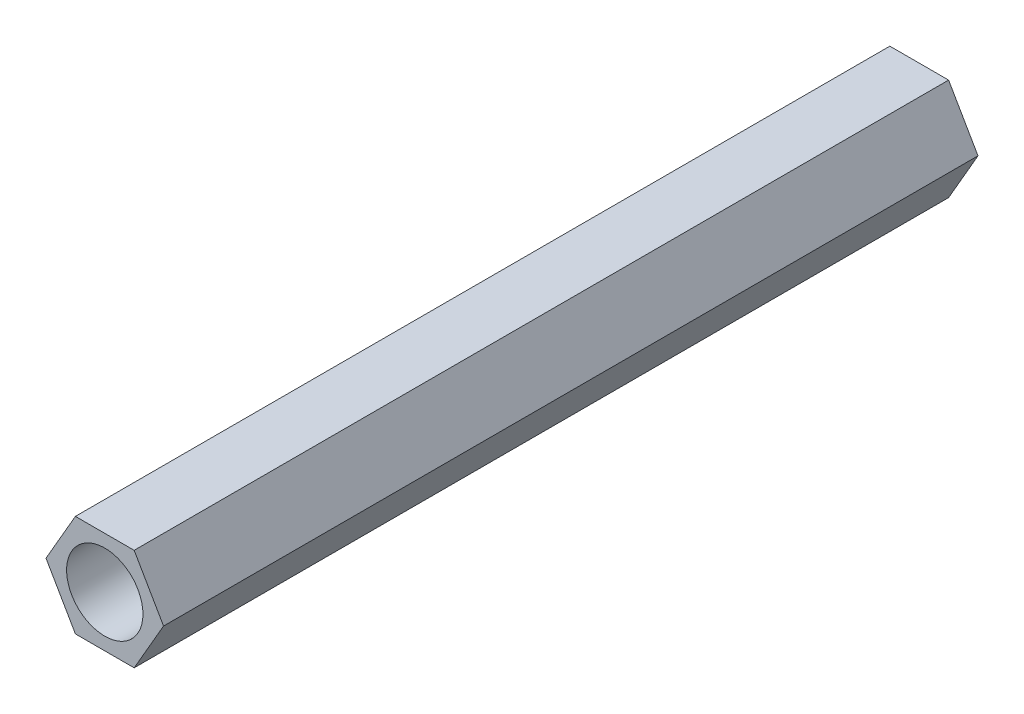
ISO-10303-21;
HEADER;
FILE_DESCRIPTION(('STEP AP214'),'2;1');
FILE_NAME('part.step','',(''),(''),'','','');
FILE_SCHEMA(('AUTOMOTIVE_DESIGN { 1 0 10303 214 1 1 1 1 }'));
ENDSEC;
DATA;
#1=APPLICATION_CONTEXT('core data for automotive mechanical design processes');
#2=APPLICATION_PROTOCOL_DEFINITION('international standard','automotive_design',2000,#1);
#3=PRODUCT_CONTEXT('',#1,'mechanical');
#4=PRODUCT('Part','Part','',(#3));
#5=PRODUCT_RELATED_PRODUCT_CATEGORY('part','',(#4));
#6=PRODUCT_DEFINITION_FORMATION('','',#4);
#7=PRODUCT_DEFINITION_CONTEXT('part definition',#1,'design');
#8=PRODUCT_DEFINITION('design','',#6,#7);
#9=PRODUCT_DEFINITION_SHAPE('','',#8);
#10=(LENGTH_UNIT() NAMED_UNIT(*) SI_UNIT(.MILLI.,.METRE.));
#11=(NAMED_UNIT(*) PLANE_ANGLE_UNIT() SI_UNIT($,.RADIAN.));
#12=(NAMED_UNIT(*) SI_UNIT($,.STERADIAN.) SOLID_ANGLE_UNIT());
#13=UNCERTAINTY_MEASURE_WITH_UNIT(LENGTH_MEASURE(1.E-05),#10,'distance_accuracy_value','');
#14=(GEOMETRIC_REPRESENTATION_CONTEXT(3) GLOBAL_UNCERTAINTY_ASSIGNED_CONTEXT((#13)) GLOBAL_UNIT_ASSIGNED_CONTEXT((#10,
#11,#12)) REPRESENTATION_CONTEXT('',''));
#15=CARTESIAN_POINT('',(0.,0.,0.));
#16=DIRECTION('',(0.,0.,1.));
#17=DIRECTION('',(1.,0.,0.));
#18=AXIS2_PLACEMENT_3D('',#15,#16,#17);
#19=CARTESIAN_POINT('',(0.,0.,32.));
#20=DIRECTION('',(0.,0.,1.));
#21=DIRECTION('',(1.,0.,0.));
#22=AXIS2_PLACEMENT_3D('',#19,#20,#21);
#23=PLANE('',#22);
#24=DIRECTION('',(0.5,0.866025403784439,0.));
#25=VECTOR('',#24,1.);
#26=CARTESIAN_POINT('',(1.15470053837925,-2.,32.));
#27=LINE('',#26,#25);
#28=CARTESIAN_POINT('',(1.15470053837925,-2.,32.));
#29=VERTEX_POINT('',#28);
#30=CARTESIAN_POINT('',(2.3094010767585,0.,32.));
#31=VERTEX_POINT('',#30);
#32=EDGE_CURVE('E150',#29,#31,#27,.T.);
#33=ORIENTED_EDGE('',*,*,#32,.T.);
#34=DIRECTION('',(-0.5,0.866025403784439,0.));
#35=VECTOR('',#34,1.);
#36=CARTESIAN_POINT('',(2.3094010767585,0.,32.));
#37=LINE('',#36,#35);
#38=CARTESIAN_POINT('',(1.15470053837925,2.,32.));
#39=VERTEX_POINT('',#38);
#40=EDGE_CURVE('E98',#31,#39,#37,.T.);
#41=ORIENTED_EDGE('',*,*,#40,.T.);
#42=DIRECTION('',(-1.,0.,0.));
#43=VECTOR('',#42,1.);
#44=CARTESIAN_POINT('',(1.15470053837925,2.,32.));
#45=LINE('',#44,#43);
#46=CARTESIAN_POINT('',(-1.15470053837925,2.,32.));
#47=VERTEX_POINT('',#46);
#48=EDGE_CURVE('E111',#39,#47,#45,.T.);
#49=ORIENTED_EDGE('',*,*,#48,.T.);
#50=DIRECTION('',(-0.5,-0.866025403784439,0.));
#51=VECTOR('',#50,1.);
#52=CARTESIAN_POINT('',(-1.15470053837925,2.,32.));
#53=LINE('',#52,#51);
#54=CARTESIAN_POINT('',(-2.3094010767585,0.,32.));
#55=VERTEX_POINT('',#54);
#56=EDGE_CURVE('E105',#47,#55,#53,.T.);
#57=ORIENTED_EDGE('',*,*,#56,.T.);
#58=DIRECTION('',(0.5,-0.866025403784438,0.));
#59=VECTOR('',#58,1.);
#60=CARTESIAN_POINT('',(-2.3094010767585,0.,32.));
#61=LINE('',#60,#59);
#62=CARTESIAN_POINT('',(-1.15470053837925,-2.,32.));
#63=VERTEX_POINT('',#62);
#64=EDGE_CURVE('E109',#55,#63,#61,.T.);
#65=ORIENTED_EDGE('',*,*,#64,.T.);
#66=DIRECTION('',(1.,0.,0.));
#67=VECTOR('',#66,1.);
#68=CARTESIAN_POINT('',(-1.15470053837925,-2.,32.));
#69=LINE('',#68,#67);
#70=EDGE_CURVE('E61',#63,#29,#69,.T.);
#71=ORIENTED_EDGE('',*,*,#70,.T.);
#72=EDGE_LOOP('',(#33,#41,#49,#57,#65,#71));
#73=FACE_BOUND('',#72,.T.);
#74=CARTESIAN_POINT('',(0.,0.,32.));
#75=DIRECTION('',(0.,0.,1.));
#76=DIRECTION('',(1.,0.,0.));
#77=AXIS2_PLACEMENT_3D('',#74,#75,#76);
#78=CIRCLE('',#77,1.5);
#79=CARTESIAN_POINT('',(1.5,0.,32.));
#80=VERTEX_POINT('',#79);
#81=EDGE_CURVE('E138',#80,#80,#78,.T.);
#82=ORIENTED_EDGE('',*,*,#81,.F.);
#83=EDGE_LOOP('',(#82));
#84=FACE_BOUND('',#83,.T.);
#85=ADVANCED_FACE('F43',(#73,#84),#23,.T.);
#86=CARTESIAN_POINT('',(0.,0.,0.));
#87=DIRECTION('',(0.,0.,1.));
#88=DIRECTION('',(1.,0.,0.));
#89=AXIS2_PLACEMENT_3D('',#86,#87,#88);
#90=PLANE('',#89);
#91=DIRECTION('',(0.5,0.866025403784439,0.));
#92=VECTOR('',#91,1.);
#93=CARTESIAN_POINT('',(1.15470053837925,-2.,0.));
#94=LINE('',#93,#92);
#95=CARTESIAN_POINT('',(1.15470053837925,-2.,0.));
#96=VERTEX_POINT('',#95);
#97=CARTESIAN_POINT('',(2.3094010767585,0.,0.));
#98=VERTEX_POINT('',#97);
#99=EDGE_CURVE('E133',#96,#98,#94,.T.);
#100=ORIENTED_EDGE('',*,*,#99,.F.);
#101=DIRECTION('',(1.,0.,0.));
#102=VECTOR('',#101,1.);
#103=CARTESIAN_POINT('',(-1.15470053837925,-2.,0.));
#104=LINE('',#103,#102);
#105=CARTESIAN_POINT('',(-1.15470053837925,-2.,0.));
#106=VERTEX_POINT('',#105);
#107=EDGE_CURVE('E90',#106,#96,#104,.T.);
#108=ORIENTED_EDGE('',*,*,#107,.F.);
#109=DIRECTION('',(0.5,-0.866025403784438,0.));
#110=VECTOR('',#109,1.);
#111=CARTESIAN_POINT('',(-2.3094010767585,0.,0.));
#112=LINE('',#111,#110);
#113=CARTESIAN_POINT('',(-2.3094010767585,0.,0.));
#114=VERTEX_POINT('',#113);
#115=EDGE_CURVE('E84',#114,#106,#112,.T.);
#116=ORIENTED_EDGE('',*,*,#115,.F.);
#117=DIRECTION('',(-0.5,-0.866025403784439,0.));
#118=VECTOR('',#117,1.);
#119=CARTESIAN_POINT('',(-1.15470053837925,2.,0.));
#120=LINE('',#119,#118);
#121=CARTESIAN_POINT('',(-1.15470053837925,2.,0.));
#122=VERTEX_POINT('',#121);
#123=EDGE_CURVE('E120',#122,#114,#120,.T.);
#124=ORIENTED_EDGE('',*,*,#123,.F.);
#125=DIRECTION('',(-1.,0.,0.));
#126=VECTOR('',#125,1.);
#127=CARTESIAN_POINT('',(1.15470053837925,2.,0.));
#128=LINE('',#127,#126);
#129=CARTESIAN_POINT('',(1.15470053837925,2.,0.));
#130=VERTEX_POINT('',#129);
#131=EDGE_CURVE('E141',#130,#122,#128,.T.);
#132=ORIENTED_EDGE('',*,*,#131,.F.);
#133=DIRECTION('',(-0.5,0.866025403784439,0.));
#134=VECTOR('',#133,1.);
#135=CARTESIAN_POINT('',(2.3094010767585,0.,0.));
#136=LINE('',#135,#134);
#137=EDGE_CURVE('E137',#98,#130,#136,.T.);
#138=ORIENTED_EDGE('',*,*,#137,.F.);
#139=EDGE_LOOP('',(#100,#108,#116,#124,#132,#138));
#140=FACE_BOUND('',#139,.T.);
#141=CARTESIAN_POINT('',(0.,0.,0.));
#142=DIRECTION('',(0.,0.,1.));
#143=DIRECTION('',(1.,0.,0.));
#144=AXIS2_PLACEMENT_3D('',#141,#142,#143);
#145=CIRCLE('',#144,1.5);
#146=CARTESIAN_POINT('',(1.5,0.,0.));
#147=VERTEX_POINT('',#146);
#148=EDGE_CURVE('E265',#147,#147,#145,.T.);
#149=ORIENTED_EDGE('',*,*,#148,.T.);
#150=EDGE_LOOP('',(#149));
#151=FACE_BOUND('',#150,.T.);
#152=ADVANCED_FACE('F163',(#140,#151),#90,.F.);
#153=CARTESIAN_POINT('',(1.15470053837925,-2.,32.));
#154=DIRECTION('',(-0.866025403784439,0.5,0.));
#155=DIRECTION('',(-0.5,-0.866025403784439,0.));
#156=AXIS2_PLACEMENT_3D('',#153,#154,#155);
#157=PLANE('',#156);
#158=ORIENTED_EDGE('',*,*,#99,.T.);
#159=DIRECTION('',(0.,0.,-1.));
#160=VECTOR('',#159,1.);
#161=CARTESIAN_POINT('',(2.3094010767585,0.,32.));
#162=LINE('',#161,#160);
#163=EDGE_CURVE('E11',#31,#98,#162,.T.);
#164=ORIENTED_EDGE('',*,*,#163,.F.);
#165=ORIENTED_EDGE('',*,*,#32,.F.);
#166=DIRECTION('',(0.,0.,-1.));
#167=VECTOR('',#166,1.);
#168=CARTESIAN_POINT('',(1.15470053837925,-2.,32.));
#169=LINE('',#168,#167);
#170=EDGE_CURVE('E129',#29,#96,#169,.T.);
#171=ORIENTED_EDGE('',*,*,#170,.T.);
#172=EDGE_LOOP('',(#158,#164,#165,#171));
#173=FACE_BOUND('',#172,.T.);
#174=ADVANCED_FACE('F45',(#173),#157,.F.);
#175=CARTESIAN_POINT('',(2.3094010767585,0.,32.));
#176=DIRECTION('',(-0.866025403784439,-0.5,0.));
#177=DIRECTION('',(0.5,-0.866025403784439,0.));
#178=AXIS2_PLACEMENT_3D('',#175,#176,#177);
#179=PLANE('',#178);
#180=ORIENTED_EDGE('',*,*,#137,.T.);
#181=DIRECTION('',(0.,0.,-1.));
#182=VECTOR('',#181,1.);
#183=CARTESIAN_POINT('',(1.15470053837925,2.,32.));
#184=LINE('',#183,#182);
#185=EDGE_CURVE('E53',#39,#130,#184,.T.);
#186=ORIENTED_EDGE('',*,*,#185,.F.);
#187=ORIENTED_EDGE('',*,*,#40,.F.);
#188=ORIENTED_EDGE('',*,*,#163,.T.);
#189=EDGE_LOOP('',(#180,#186,#187,#188));
#190=FACE_BOUND('',#189,.T.);
#191=ADVANCED_FACE('F188',(#190),#179,.F.);
#192=CARTESIAN_POINT('',(1.15470053837925,2.,32.));
#193=DIRECTION('',(0.,-1.,0.));
#194=DIRECTION('',(0.,0.,-1.));
#195=AXIS2_PLACEMENT_3D('',#192,#193,#194);
#196=PLANE('',#195);
#197=ORIENTED_EDGE('',*,*,#131,.T.);
#198=DIRECTION('',(0.,0.,-1.));
#199=VECTOR('',#198,1.);
#200=CARTESIAN_POINT('',(-1.15470053837925,2.,32.));
#201=LINE('',#200,#199);
#202=EDGE_CURVE('E122',#47,#122,#201,.T.);
#203=ORIENTED_EDGE('',*,*,#202,.F.);
#204=ORIENTED_EDGE('',*,*,#48,.F.);
#205=ORIENTED_EDGE('',*,*,#185,.T.);
#206=EDGE_LOOP('',(#197,#203,#204,#205));
#207=FACE_BOUND('',#206,.T.);
#208=ADVANCED_FACE('F160',(#207),#196,.F.);
#209=CARTESIAN_POINT('',(-1.15470053837925,2.,32.));
#210=DIRECTION('',(0.866025403784439,-0.5,0.));
#211=DIRECTION('',(0.5,0.866025403784439,0.));
#212=AXIS2_PLACEMENT_3D('',#209,#210,#211);
#213=PLANE('',#212);
#214=ORIENTED_EDGE('',*,*,#123,.T.);
#215=DIRECTION('',(0.,0.,-1.));
#216=VECTOR('',#215,1.);
#217=CARTESIAN_POINT('',(-2.3094010767585,0.,32.));
#218=LINE('',#217,#216);
#219=EDGE_CURVE('E117',#55,#114,#218,.T.);
#220=ORIENTED_EDGE('',*,*,#219,.F.);
#221=ORIENTED_EDGE('',*,*,#56,.F.);
#222=ORIENTED_EDGE('',*,*,#202,.T.);
#223=EDGE_LOOP('',(#214,#220,#221,#222));
#224=FACE_BOUND('',#223,.T.);
#225=ADVANCED_FACE('F118',(#224),#213,.F.);
#226=CARTESIAN_POINT('',(-2.3094010767585,0.,32.));
#227=DIRECTION('',(0.866025403784438,0.5,0.));
#228=DIRECTION('',(-0.5,0.866025403784438,0.));
#229=AXIS2_PLACEMENT_3D('',#226,#227,#228);
#230=PLANE('',#229);
#231=ORIENTED_EDGE('',*,*,#115,.T.);
#232=DIRECTION('',(0.,0.,-1.));
#233=VECTOR('',#232,1.);
#234=CARTESIAN_POINT('',(-1.15470053837925,-2.,32.));
#235=LINE('',#234,#233);
#236=EDGE_CURVE('E123',#63,#106,#235,.T.);
#237=ORIENTED_EDGE('',*,*,#236,.F.);
#238=ORIENTED_EDGE('',*,*,#64,.F.);
#239=ORIENTED_EDGE('',*,*,#219,.T.);
#240=EDGE_LOOP('',(#231,#237,#238,#239));
#241=FACE_BOUND('',#240,.T.);
#242=ADVANCED_FACE('F125',(#241),#230,.F.);
#243=CARTESIAN_POINT('',(-1.15470053837925,-2.,32.));
#244=DIRECTION('',(0.,1.,0.));
#245=DIRECTION('',(0.,0.,1.));
#246=AXIS2_PLACEMENT_3D('',#243,#244,#245);
#247=PLANE('',#246);
#248=ORIENTED_EDGE('',*,*,#107,.T.);
#249=ORIENTED_EDGE('',*,*,#170,.F.);
#250=ORIENTED_EDGE('',*,*,#70,.F.);
#251=ORIENTED_EDGE('',*,*,#236,.T.);
#252=EDGE_LOOP('',(#248,#249,#250,#251));
#253=FACE_BOUND('',#252,.T.);
#254=ADVANCED_FACE('F168',(#253),#247,.F.);
#255=CARTESIAN_POINT('',(0.,0.,32.));
#256=DIRECTION('',(0.,0.,-1.));
#257=DIRECTION('',(-1.,0.,0.));
#258=AXIS2_PLACEMENT_3D('',#255,#256,#257);
#259=CYLINDRICAL_SURFACE('',#258,1.5);
#260=ORIENTED_EDGE('',*,*,#81,.T.);
#261=EDGE_LOOP('',(#260));
#262=FACE_BOUND('',#261,.T.);
#263=ORIENTED_EDGE('',*,*,#148,.F.);
#264=EDGE_LOOP('',(#263));
#265=FACE_BOUND('',#264,.T.);
#266=ADVANCED_FACE('F170',(#262,#265),#259,.F.);
#267=CLOSED_SHELL('',(#85,#152,#174,#191,#208,#225,#242,#254,#266));
#268=MANIFOLD_SOLID_BREP('B2',#267);
#269=ADVANCED_BREP_SHAPE_REPRESENTATION('',(#18,#268),#14);
#270=SHAPE_DEFINITION_REPRESENTATION(#9,#269);
ENDSEC;
END-ISO-10303-21;
